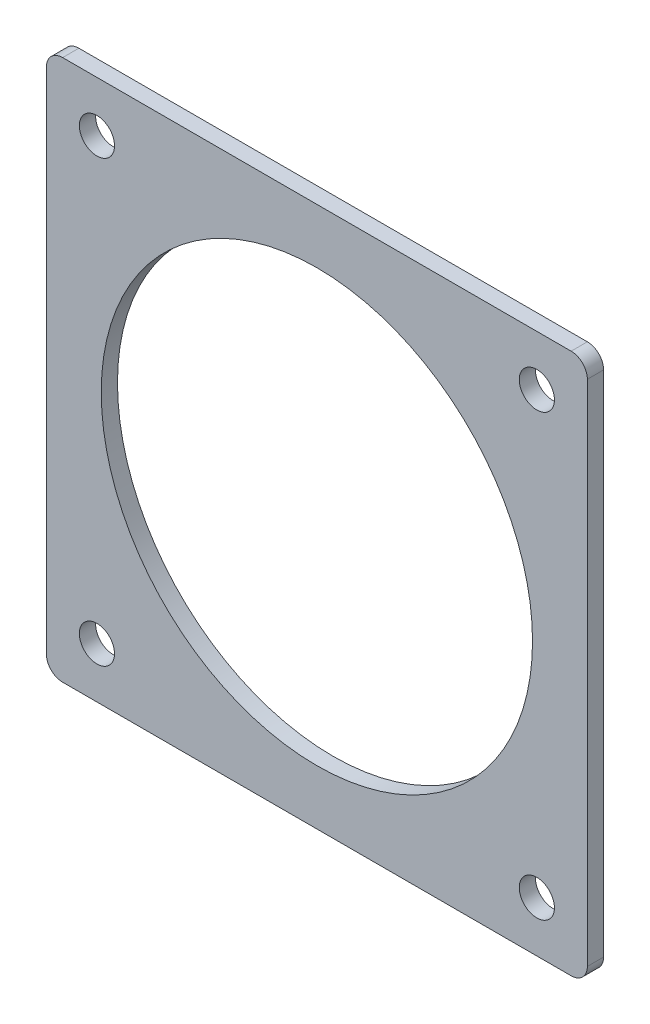
ISO-10303-21;
HEADER;
FILE_DESCRIPTION(('STEP AP214'),'2;1');
FILE_NAME('part.step','',(''),(''),'','','');
FILE_SCHEMA(('AUTOMOTIVE_DESIGN { 1 0 10303 214 1 1 1 1 }'));
ENDSEC;
DATA;
#1=APPLICATION_CONTEXT('core data for automotive mechanical design processes');
#2=APPLICATION_PROTOCOL_DEFINITION('international standard','automotive_design',2000,#1);
#3=PRODUCT_CONTEXT('',#1,'mechanical');
#4=PRODUCT('Part','Part','',(#3));
#5=PRODUCT_RELATED_PRODUCT_CATEGORY('part','',(#4));
#6=PRODUCT_DEFINITION_FORMATION('','',#4);
#7=PRODUCT_DEFINITION_CONTEXT('part definition',#1,'design');
#8=PRODUCT_DEFINITION('design','',#6,#7);
#9=PRODUCT_DEFINITION_SHAPE('','',#8);
#10=(LENGTH_UNIT() NAMED_UNIT(*) SI_UNIT(.MILLI.,.METRE.));
#11=(NAMED_UNIT(*) PLANE_ANGLE_UNIT() SI_UNIT($,.RADIAN.));
#12=(NAMED_UNIT(*) SI_UNIT($,.STERADIAN.) SOLID_ANGLE_UNIT());
#13=UNCERTAINTY_MEASURE_WITH_UNIT(LENGTH_MEASURE(1.E-05),#10,'distance_accuracy_value','');
#14=(GEOMETRIC_REPRESENTATION_CONTEXT(3) GLOBAL_UNCERTAINTY_ASSIGNED_CONTEXT((#13)) GLOBAL_UNIT_ASSIGNED_CONTEXT((#10,
#11,#12)) REPRESENTATION_CONTEXT('',''));
#15=CARTESIAN_POINT('',(0.,0.,0.));
#16=DIRECTION('',(0.,0.,1.));
#17=DIRECTION('',(1.,0.,0.));
#18=AXIS2_PLACEMENT_3D('',#15,#16,#17);
#19=CARTESIAN_POINT('',(47.,47.,3.));
#20=DIRECTION('',(0.,0.,-1.));
#21=DIRECTION('',(-1.,0.,0.));
#22=AXIS2_PLACEMENT_3D('',#19,#20,#21);
#23=PLANE('',#22);
#24=CARTESIAN_POINT('',(47.,47.,3.));
#25=DIRECTION('',(0.,0.,1.));
#26=DIRECTION('',(-1.,0.,0.));
#27=AXIS2_PLACEMENT_3D('',#24,#25,#26);
#28=CIRCLE('',#27,3.);
#29=CARTESIAN_POINT('',(50.,47.,3.));
#30=VERTEX_POINT('',#29);
#31=CARTESIAN_POINT('',(47.,50.,3.));
#32=VERTEX_POINT('',#31);
#33=EDGE_CURVE('E145',#30,#32,#28,.T.);
#34=ORIENTED_EDGE('',*,*,#33,.T.);
#35=DIRECTION('',(-1.,0.,0.));
#36=VECTOR('',#35,1.);
#37=CARTESIAN_POINT('',(-47.,50.,3.));
#38=LINE('',#37,#36);
#39=CARTESIAN_POINT('',(-47.,50.,3.));
#40=VERTEX_POINT('',#39);
#41=EDGE_CURVE('E93',#32,#40,#38,.T.);
#42=ORIENTED_EDGE('',*,*,#41,.T.);
#43=CARTESIAN_POINT('',(-47.,47.,3.));
#44=DIRECTION('',(0.,0.,1.));
#45=DIRECTION('',(1.,0.,0.));
#46=AXIS2_PLACEMENT_3D('',#43,#44,#45);
#47=CIRCLE('',#46,3.);
#48=CARTESIAN_POINT('',(-50.,47.,3.));
#49=VERTEX_POINT('',#48);
#50=EDGE_CURVE('E160',#40,#49,#47,.T.);
#51=ORIENTED_EDGE('',*,*,#50,.T.);
#52=DIRECTION('',(0.,-1.,0.));
#53=VECTOR('',#52,1.);
#54=CARTESIAN_POINT('',(-50.,47.,3.));
#55=LINE('',#54,#53);
#56=CARTESIAN_POINT('',(-50.,-47.,3.));
#57=VERTEX_POINT('',#56);
#58=EDGE_CURVE('E173',#49,#57,#55,.T.);
#59=ORIENTED_EDGE('',*,*,#58,.T.);
#60=CARTESIAN_POINT('',(-47.,-47.,3.));
#61=DIRECTION('',(0.,0.,1.));
#62=DIRECTION('',(1.,0.,0.));
#63=AXIS2_PLACEMENT_3D('',#60,#61,#62);
#64=CIRCLE('',#63,3.);
#65=CARTESIAN_POINT('',(-47.,-50.,3.));
#66=VERTEX_POINT('',#65);
#67=EDGE_CURVE('E112',#57,#66,#64,.T.);
#68=ORIENTED_EDGE('',*,*,#67,.T.);
#69=DIRECTION('',(1.,0.,0.));
#70=VECTOR('',#69,1.);
#71=CARTESIAN_POINT('',(-47.,-50.,3.));
#72=LINE('',#71,#70);
#73=CARTESIAN_POINT('',(47.,-50.,3.));
#74=VERTEX_POINT('',#73);
#75=EDGE_CURVE('E106',#66,#74,#72,.T.);
#76=ORIENTED_EDGE('',*,*,#75,.T.);
#77=CARTESIAN_POINT('',(47.,-47.,3.));
#78=DIRECTION('',(0.,0.,1.));
#79=DIRECTION('',(1.,0.,0.));
#80=AXIS2_PLACEMENT_3D('',#77,#78,#79);
#81=CIRCLE('',#80,3.);
#82=CARTESIAN_POINT('',(50.,-47.,3.));
#83=VERTEX_POINT('',#82);
#84=EDGE_CURVE('E110',#74,#83,#81,.T.);
#85=ORIENTED_EDGE('',*,*,#84,.T.);
#86=DIRECTION('',(0.,1.,0.));
#87=VECTOR('',#86,1.);
#88=CARTESIAN_POINT('',(50.,47.,3.));
#89=LINE('',#88,#87);
#90=EDGE_CURVE('E50',#83,#30,#89,.T.);
#91=ORIENTED_EDGE('',*,*,#90,.T.);
#92=EDGE_LOOP('',(#34,#42,#51,#59,#68,#76,#85,#91));
#93=FACE_BOUND('',#92,.T.);
#94=CARTESIAN_POINT('',(0.,0.,3.));
#95=DIRECTION('',(0.,0.,1.));
#96=DIRECTION('',(1.,0.,0.));
#97=AXIS2_PLACEMENT_3D('',#94,#95,#96);
#98=CIRCLE('',#97,39.8626624154982);
#99=CARTESIAN_POINT('',(39.8626624154982,0.,3.));
#100=VERTEX_POINT('',#99);
#101=EDGE_CURVE('E134',#100,#100,#98,.T.);
#102=ORIENTED_EDGE('',*,*,#101,.F.);
#103=EDGE_LOOP('',(#102));
#104=FACE_BOUND('',#103,.T.);
#105=CARTESIAN_POINT('',(40.6586399182265,40.6586399182265,3.));
#106=DIRECTION('',(0.,0.,1.));
#107=DIRECTION('',(1.,0.,0.));
#108=AXIS2_PLACEMENT_3D('',#105,#106,#107);
#109=CIRCLE('',#108,3.25000000000001);
#110=CARTESIAN_POINT('',(43.9086399182265,40.6586399182265,3.));
#111=VERTEX_POINT('',#110);
#112=EDGE_CURVE('E182',#111,#111,#109,.T.);
#113=ORIENTED_EDGE('',*,*,#112,.F.);
#114=EDGE_LOOP('',(#113));
#115=FACE_BOUND('',#114,.T.);
#116=CARTESIAN_POINT('',(-40.6586399182265,40.6586399182265,3.));
#117=DIRECTION('',(0.,0.,1.));
#118=DIRECTION('',(1.,0.,0.));
#119=AXIS2_PLACEMENT_3D('',#116,#117,#118);
#120=CIRCLE('',#119,3.25000000000001);
#121=CARTESIAN_POINT('',(-37.4086399182265,40.6586399182265,3.));
#122=VERTEX_POINT('',#121);
#123=EDGE_CURVE('E188',#122,#122,#120,.T.);
#124=ORIENTED_EDGE('',*,*,#123,.F.);
#125=EDGE_LOOP('',(#124));
#126=FACE_BOUND('',#125,.T.);
#127=CARTESIAN_POINT('',(-40.6586399182265,-40.6586399182265,3.));
#128=DIRECTION('',(0.,0.,1.));
#129=DIRECTION('',(1.,0.,0.));
#130=AXIS2_PLACEMENT_3D('',#127,#128,#129);
#131=CIRCLE('',#130,3.25000000000001);
#132=CARTESIAN_POINT('',(-37.4086399182265,-40.6586399182265,3.));
#133=VERTEX_POINT('',#132);
#134=EDGE_CURVE('E194',#133,#133,#131,.T.);
#135=ORIENTED_EDGE('',*,*,#134,.F.);
#136=EDGE_LOOP('',(#135));
#137=FACE_BOUND('',#136,.T.);
#138=CARTESIAN_POINT('',(40.6586399182265,-40.6586399182265,3.));
#139=DIRECTION('',(0.,0.,1.));
#140=DIRECTION('',(1.,0.,0.));
#141=AXIS2_PLACEMENT_3D('',#138,#139,#140);
#142=CIRCLE('',#141,3.25000000000001);
#143=CARTESIAN_POINT('',(43.9086399182265,-40.6586399182265,3.));
#144=VERTEX_POINT('',#143);
#145=EDGE_CURVE('E200',#144,#144,#142,.T.);
#146=ORIENTED_EDGE('',*,*,#145,.F.);
#147=EDGE_LOOP('',(#146));
#148=FACE_BOUND('',#147,.T.);
#149=ADVANCED_FACE('F33',(#93,#104,#115,#126,#137,#148),#23,.F.);
#150=CARTESIAN_POINT('',(47.,47.,0.));
#151=DIRECTION('',(0.,0.,-1.));
#152=DIRECTION('',(-1.,0.,0.));
#153=AXIS2_PLACEMENT_3D('',#150,#151,#152);
#154=PLANE('',#153);
#155=CARTESIAN_POINT('',(-40.6586399182265,-40.6586399182265,0.));
#156=DIRECTION('',(0.,0.,1.));
#157=DIRECTION('',(1.,0.,0.));
#158=AXIS2_PLACEMENT_3D('',#155,#156,#157);
#159=CIRCLE('',#158,3.25000000000001);
#160=CARTESIAN_POINT('',(-37.4086399182265,-40.6586399182265,0.));
#161=VERTEX_POINT('',#160);
#162=EDGE_CURVE('E197',#161,#161,#159,.T.);
#163=ORIENTED_EDGE('',*,*,#162,.T.);
#164=EDGE_LOOP('',(#163));
#165=FACE_BOUND('',#164,.T.);
#166=CARTESIAN_POINT('',(40.6586399182265,40.6586399182265,0.));
#167=DIRECTION('',(0.,0.,1.));
#168=DIRECTION('',(1.,0.,0.));
#169=AXIS2_PLACEMENT_3D('',#166,#167,#168);
#170=CIRCLE('',#169,3.25000000000001);
#171=CARTESIAN_POINT('',(43.9086399182265,40.6586399182265,0.));
#172=VERTEX_POINT('',#171);
#173=EDGE_CURVE('E185',#172,#172,#170,.T.);
#174=ORIENTED_EDGE('',*,*,#173,.T.);
#175=EDGE_LOOP('',(#174));
#176=FACE_BOUND('',#175,.T.);
#177=CARTESIAN_POINT('',(47.,47.,0.));
#178=DIRECTION('',(0.,0.,1.));
#179=DIRECTION('',(-1.,0.,0.));
#180=AXIS2_PLACEMENT_3D('',#177,#178,#179);
#181=CIRCLE('',#180,3.);
#182=CARTESIAN_POINT('',(50.,47.,0.));
#183=VERTEX_POINT('',#182);
#184=CARTESIAN_POINT('',(47.,50.,0.));
#185=VERTEX_POINT('',#184);
#186=EDGE_CURVE('E130',#183,#185,#181,.T.);
#187=ORIENTED_EDGE('',*,*,#186,.F.);
#188=DIRECTION('',(0.,1.,0.));
#189=VECTOR('',#188,1.);
#190=CARTESIAN_POINT('',(50.,47.,0.));
#191=LINE('',#190,#189);
#192=CARTESIAN_POINT('',(50.,-47.,0.));
#193=VERTEX_POINT('',#192);
#194=EDGE_CURVE('E85',#193,#183,#191,.T.);
#195=ORIENTED_EDGE('',*,*,#194,.F.);
#196=CARTESIAN_POINT('',(47.,-47.,0.));
#197=DIRECTION('',(0.,0.,1.));
#198=DIRECTION('',(1.,0.,0.));
#199=AXIS2_PLACEMENT_3D('',#196,#197,#198);
#200=CIRCLE('',#199,3.);
#201=CARTESIAN_POINT('',(47.,-50.,0.));
#202=VERTEX_POINT('',#201);
#203=EDGE_CURVE('E79',#202,#193,#200,.T.);
#204=ORIENTED_EDGE('',*,*,#203,.F.);
#205=DIRECTION('',(1.,0.,0.));
#206=VECTOR('',#205,1.);
#207=CARTESIAN_POINT('',(-47.,-50.,0.));
#208=LINE('',#207,#206);
#209=CARTESIAN_POINT('',(-47.,-50.,0.));
#210=VERTEX_POINT('',#209);
#211=EDGE_CURVE('E120',#210,#202,#208,.T.);
#212=ORIENTED_EDGE('',*,*,#211,.F.);
#213=CARTESIAN_POINT('',(-47.,-47.,0.));
#214=DIRECTION('',(0.,0.,1.));
#215=DIRECTION('',(1.,0.,0.));
#216=AXIS2_PLACEMENT_3D('',#213,#214,#215);
#217=CIRCLE('',#216,3.);
#218=CARTESIAN_POINT('',(-50.,-47.,0.));
#219=VERTEX_POINT('',#218);
#220=EDGE_CURVE('E140',#219,#210,#217,.T.);
#221=ORIENTED_EDGE('',*,*,#220,.F.);
#222=DIRECTION('',(0.,-1.,0.));
#223=VECTOR('',#222,1.);
#224=CARTESIAN_POINT('',(-50.,47.,0.));
#225=LINE('',#224,#223);
#226=CARTESIAN_POINT('',(-50.,47.,0.));
#227=VERTEX_POINT('',#226);
#228=EDGE_CURVE('E138',#227,#219,#225,.T.);
#229=ORIENTED_EDGE('',*,*,#228,.F.);
#230=CARTESIAN_POINT('',(-47.,47.,0.));
#231=DIRECTION('',(0.,0.,1.));
#232=DIRECTION('',(1.,0.,0.));
#233=AXIS2_PLACEMENT_3D('',#230,#231,#232);
#234=CIRCLE('',#233,3.);
#235=CARTESIAN_POINT('',(-47.,50.,0.));
#236=VERTEX_POINT('',#235);
#237=EDGE_CURVE('E136',#236,#227,#234,.T.);
#238=ORIENTED_EDGE('',*,*,#237,.F.);
#239=DIRECTION('',(-1.,0.,0.));
#240=VECTOR('',#239,1.);
#241=CARTESIAN_POINT('',(-47.,50.,0.));
#242=LINE('',#241,#240);
#243=EDGE_CURVE('E133',#185,#236,#242,.T.);
#244=ORIENTED_EDGE('',*,*,#243,.F.);
#245=EDGE_LOOP('',(#187,#195,#204,#212,#221,#229,#238,#244));
#246=FACE_BOUND('',#245,.T.);
#247=CARTESIAN_POINT('',(0.,0.,0.));
#248=DIRECTION('',(0.,0.,1.));
#249=DIRECTION('',(1.,0.,0.));
#250=AXIS2_PLACEMENT_3D('',#247,#248,#249);
#251=CIRCLE('',#250,39.8626624154982);
#252=CARTESIAN_POINT('',(39.8626624154982,0.,0.));
#253=VERTEX_POINT('',#252);
#254=EDGE_CURVE('E179',#253,#253,#251,.T.);
#255=ORIENTED_EDGE('',*,*,#254,.T.);
#256=EDGE_LOOP('',(#255));
#257=FACE_BOUND('',#256,.T.);
#258=CARTESIAN_POINT('',(-40.6586399182265,40.6586399182265,0.));
#259=DIRECTION('',(0.,0.,1.));
#260=DIRECTION('',(1.,0.,0.));
#261=AXIS2_PLACEMENT_3D('',#258,#259,#260);
#262=CIRCLE('',#261,3.25000000000001);
#263=CARTESIAN_POINT('',(-37.4086399182265,40.6586399182265,0.));
#264=VERTEX_POINT('',#263);
#265=EDGE_CURVE('E191',#264,#264,#262,.T.);
#266=ORIENTED_EDGE('',*,*,#265,.T.);
#267=EDGE_LOOP('',(#266));
#268=FACE_BOUND('',#267,.T.);
#269=CARTESIAN_POINT('',(40.6586399182265,-40.6586399182265,0.));
#270=DIRECTION('',(0.,0.,1.));
#271=DIRECTION('',(1.,0.,0.));
#272=AXIS2_PLACEMENT_3D('',#269,#270,#271);
#273=CIRCLE('',#272,3.25000000000001);
#274=CARTESIAN_POINT('',(43.9086399182265,-40.6586399182265,0.));
#275=VERTEX_POINT('',#274);
#276=EDGE_CURVE('E203',#275,#275,#273,.T.);
#277=ORIENTED_EDGE('',*,*,#276,.T.);
#278=EDGE_LOOP('',(#277));
#279=FACE_BOUND('',#278,.T.);
#280=ADVANCED_FACE('F164',(#165,#176,#246,#257,#268,#279),#154,.T.);
#281=CARTESIAN_POINT('',(47.,47.,3.));
#282=DIRECTION('',(0.,0.,-1.));
#283=DIRECTION('',(-1.,0.,0.));
#284=AXIS2_PLACEMENT_3D('',#281,#282,#283);
#285=CYLINDRICAL_SURFACE('',#284,3.);
#286=ORIENTED_EDGE('',*,*,#186,.T.);
#287=DIRECTION('',(0.,0.,-1.));
#288=VECTOR('',#287,1.);
#289=CARTESIAN_POINT('',(47.,50.,3.));
#290=LINE('',#289,#288);
#291=EDGE_CURVE('E11',#32,#185,#290,.T.);
#292=ORIENTED_EDGE('',*,*,#291,.F.);
#293=ORIENTED_EDGE('',*,*,#33,.F.);
#294=DIRECTION('',(0.,0.,-1.));
#295=VECTOR('',#294,1.);
#296=CARTESIAN_POINT('',(50.,47.,3.));
#297=LINE('',#296,#295);
#298=EDGE_CURVE('E126',#30,#183,#297,.T.);
#299=ORIENTED_EDGE('',*,*,#298,.T.);
#300=EDGE_LOOP('',(#286,#292,#293,#299));
#301=FACE_BOUND('',#300,.T.);
#302=ADVANCED_FACE('F35',(#301),#285,.T.);
#303=CARTESIAN_POINT('',(-47.,50.,3.));
#304=DIRECTION('',(0.,-1.,0.));
#305=DIRECTION('',(0.,0.,-1.));
#306=AXIS2_PLACEMENT_3D('',#303,#304,#305);
#307=PLANE('',#306);
#308=ORIENTED_EDGE('',*,*,#243,.T.);
#309=DIRECTION('',(0.,0.,-1.));
#310=VECTOR('',#309,1.);
#311=CARTESIAN_POINT('',(-47.,50.,3.));
#312=LINE('',#311,#310);
#313=EDGE_CURVE('E42',#40,#236,#312,.T.);
#314=ORIENTED_EDGE('',*,*,#313,.F.);
#315=ORIENTED_EDGE('',*,*,#41,.F.);
#316=ORIENTED_EDGE('',*,*,#291,.T.);
#317=EDGE_LOOP('',(#308,#314,#315,#316));
#318=FACE_BOUND('',#317,.T.);
#319=ADVANCED_FACE('F235',(#318),#307,.F.);
#320=CARTESIAN_POINT('',(-47.,47.,3.));
#321=DIRECTION('',(0.,0.,-1.));
#322=DIRECTION('',(-1.,0.,0.));
#323=AXIS2_PLACEMENT_3D('',#320,#321,#322);
#324=CYLINDRICAL_SURFACE('',#323,3.);
#325=ORIENTED_EDGE('',*,*,#237,.T.);
#326=DIRECTION('',(0.,0.,-1.));
#327=VECTOR('',#326,1.);
#328=CARTESIAN_POINT('',(-50.,47.,3.));
#329=LINE('',#328,#327);
#330=EDGE_CURVE('E152',#49,#227,#329,.T.);
#331=ORIENTED_EDGE('',*,*,#330,.F.);
#332=ORIENTED_EDGE('',*,*,#50,.F.);
#333=ORIENTED_EDGE('',*,*,#313,.T.);
#334=EDGE_LOOP('',(#325,#331,#332,#333));
#335=FACE_BOUND('',#334,.T.);
#336=ADVANCED_FACE('F158',(#335),#324,.T.);
#337=CARTESIAN_POINT('',(-50.,47.,3.));
#338=DIRECTION('',(1.,0.,0.));
#339=DIRECTION('',(0.,1.,0.));
#340=AXIS2_PLACEMENT_3D('',#337,#338,#339);
#341=PLANE('',#340);
#342=ORIENTED_EDGE('',*,*,#228,.T.);
#343=DIRECTION('',(0.,0.,-1.));
#344=VECTOR('',#343,1.);
#345=CARTESIAN_POINT('',(-50.,-47.,3.));
#346=LINE('',#345,#344);
#347=EDGE_CURVE('E149',#57,#219,#346,.T.);
#348=ORIENTED_EDGE('',*,*,#347,.F.);
#349=ORIENTED_EDGE('',*,*,#58,.F.);
#350=ORIENTED_EDGE('',*,*,#330,.T.);
#351=EDGE_LOOP('',(#342,#348,#349,#350));
#352=FACE_BOUND('',#351,.T.);
#353=ADVANCED_FACE('F169',(#352),#341,.F.);
#354=CARTESIAN_POINT('',(-47.,-47.,3.));
#355=DIRECTION('',(0.,0.,-1.));
#356=DIRECTION('',(-1.,0.,0.));
#357=AXIS2_PLACEMENT_3D('',#354,#355,#356);
#358=CYLINDRICAL_SURFACE('',#357,3.);
#359=ORIENTED_EDGE('',*,*,#220,.T.);
#360=DIRECTION('',(0.,0.,-1.));
#361=VECTOR('',#360,1.);
#362=CARTESIAN_POINT('',(-47.,-50.,3.));
#363=LINE('',#362,#361);
#364=EDGE_CURVE('E121',#66,#210,#363,.T.);
#365=ORIENTED_EDGE('',*,*,#364,.F.);
#366=ORIENTED_EDGE('',*,*,#67,.F.);
#367=ORIENTED_EDGE('',*,*,#347,.T.);
#368=EDGE_LOOP('',(#359,#365,#366,#367));
#369=FACE_BOUND('',#368,.T.);
#370=ADVANCED_FACE('F172',(#369),#358,.T.);
#371=CARTESIAN_POINT('',(-47.,-50.,3.));
#372=DIRECTION('',(0.,1.,0.));
#373=DIRECTION('',(0.,0.,1.));
#374=AXIS2_PLACEMENT_3D('',#371,#372,#373);
#375=PLANE('',#374);
#376=ORIENTED_EDGE('',*,*,#211,.T.);
#377=DIRECTION('',(0.,0.,-1.));
#378=VECTOR('',#377,1.);
#379=CARTESIAN_POINT('',(47.,-50.,3.));
#380=LINE('',#379,#378);
#381=EDGE_CURVE('E117',#74,#202,#380,.T.);
#382=ORIENTED_EDGE('',*,*,#381,.F.);
#383=ORIENTED_EDGE('',*,*,#75,.F.);
#384=ORIENTED_EDGE('',*,*,#364,.T.);
#385=EDGE_LOOP('',(#376,#382,#383,#384));
#386=FACE_BOUND('',#385,.T.);
#387=ADVANCED_FACE('F118',(#386),#375,.F.);
#388=CARTESIAN_POINT('',(47.,-47.,3.));
#389=DIRECTION('',(0.,0.,-1.));
#390=DIRECTION('',(-1.,0.,0.));
#391=AXIS2_PLACEMENT_3D('',#388,#389,#390);
#392=CYLINDRICAL_SURFACE('',#391,3.);
#393=ORIENTED_EDGE('',*,*,#203,.T.);
#394=DIRECTION('',(0.,0.,-1.));
#395=VECTOR('',#394,1.);
#396=CARTESIAN_POINT('',(50.,-47.,3.));
#397=LINE('',#396,#395);
#398=EDGE_CURVE('E122',#83,#193,#397,.T.);
#399=ORIENTED_EDGE('',*,*,#398,.F.);
#400=ORIENTED_EDGE('',*,*,#84,.F.);
#401=ORIENTED_EDGE('',*,*,#381,.T.);
#402=EDGE_LOOP('',(#393,#399,#400,#401));
#403=FACE_BOUND('',#402,.T.);
#404=ADVANCED_FACE('F124',(#403),#392,.T.);
#405=CARTESIAN_POINT('',(50.,47.,3.));
#406=DIRECTION('',(-1.,0.,0.));
#407=DIRECTION('',(0.,0.,1.));
#408=AXIS2_PLACEMENT_3D('',#405,#406,#407);
#409=PLANE('',#408);
#410=ORIENTED_EDGE('',*,*,#194,.T.);
#411=ORIENTED_EDGE('',*,*,#298,.F.);
#412=ORIENTED_EDGE('',*,*,#90,.F.);
#413=ORIENTED_EDGE('',*,*,#398,.T.);
#414=EDGE_LOOP('',(#410,#411,#412,#413));
#415=FACE_BOUND('',#414,.T.);
#416=ADVANCED_FACE('F223',(#415),#409,.F.);
#417=CARTESIAN_POINT('',(0.,0.,3.));
#418=DIRECTION('',(0.,0.,-1.));
#419=DIRECTION('',(-1.,0.,0.));
#420=AXIS2_PLACEMENT_3D('',#417,#418,#419);
#421=CYLINDRICAL_SURFACE('',#420,39.8626624154982);
#422=ORIENTED_EDGE('',*,*,#101,.T.);
#423=EDGE_LOOP('',(#422));
#424=FACE_BOUND('',#423,.T.);
#425=ORIENTED_EDGE('',*,*,#254,.F.);
#426=EDGE_LOOP('',(#425));
#427=FACE_BOUND('',#426,.T.);
#428=ADVANCED_FACE('F220',(#424,#427),#421,.F.);
#429=CARTESIAN_POINT('',(40.6586399182265,40.6586399182265,3.));
#430=DIRECTION('',(0.,0.,-1.));
#431=DIRECTION('',(-1.,0.,0.));
#432=AXIS2_PLACEMENT_3D('',#429,#430,#431);
#433=CYLINDRICAL_SURFACE('',#432,3.25000000000001);
#434=ORIENTED_EDGE('',*,*,#112,.T.);
#435=EDGE_LOOP('',(#434));
#436=FACE_BOUND('',#435,.T.);
#437=ORIENTED_EDGE('',*,*,#173,.F.);
#438=EDGE_LOOP('',(#437));
#439=FACE_BOUND('',#438,.T.);
#440=ADVANCED_FACE('F299',(#436,#439),#433,.F.);
#441=CARTESIAN_POINT('',(-40.6586399182265,40.6586399182265,3.));
#442=DIRECTION('',(0.,0.,-1.));
#443=DIRECTION('',(-1.,0.,0.));
#444=AXIS2_PLACEMENT_3D('',#441,#442,#443);
#445=CYLINDRICAL_SURFACE('',#444,3.25000000000001);
#446=ORIENTED_EDGE('',*,*,#123,.T.);
#447=EDGE_LOOP('',(#446));
#448=FACE_BOUND('',#447,.T.);
#449=ORIENTED_EDGE('',*,*,#265,.F.);
#450=EDGE_LOOP('',(#449));
#451=FACE_BOUND('',#450,.T.);
#452=ADVANCED_FACE('F307',(#448,#451),#445,.F.);
#453=CARTESIAN_POINT('',(-40.6586399182265,-40.6586399182265,3.));
#454=DIRECTION('',(0.,0.,-1.));
#455=DIRECTION('',(-1.,0.,0.));
#456=AXIS2_PLACEMENT_3D('',#453,#454,#455);
#457=CYLINDRICAL_SURFACE('',#456,3.25000000000001);
#458=ORIENTED_EDGE('',*,*,#134,.T.);
#459=EDGE_LOOP('',(#458));
#460=FACE_BOUND('',#459,.T.);
#461=ORIENTED_EDGE('',*,*,#162,.F.);
#462=EDGE_LOOP('',(#461));
#463=FACE_BOUND('',#462,.T.);
#464=ADVANCED_FACE('F315',(#460,#463),#457,.F.);
#465=CARTESIAN_POINT('',(40.6586399182265,-40.6586399182265,3.));
#466=DIRECTION('',(0.,0.,-1.));
#467=DIRECTION('',(-1.,0.,0.));
#468=AXIS2_PLACEMENT_3D('',#465,#466,#467);
#469=CYLINDRICAL_SURFACE('',#468,3.25000000000001);
#470=ORIENTED_EDGE('',*,*,#145,.T.);
#471=EDGE_LOOP('',(#470));
#472=FACE_BOUND('',#471,.T.);
#473=ORIENTED_EDGE('',*,*,#276,.F.);
#474=EDGE_LOOP('',(#473));
#475=FACE_BOUND('',#474,.T.);
#476=ADVANCED_FACE('F209',(#472,#475),#469,.F.);
#477=CLOSED_SHELL('',(#149,#280,#302,#319,#336,#353,#370,#387,#404,#416,#428,#440,#452,#464,#476));
#478=MANIFOLD_SOLID_BREP('B2',#477);
#479=ADVANCED_BREP_SHAPE_REPRESENTATION('',(#18,#478),#14);
#480=SHAPE_DEFINITION_REPRESENTATION(#9,#479);
ENDSEC;
END-ISO-10303-21;
